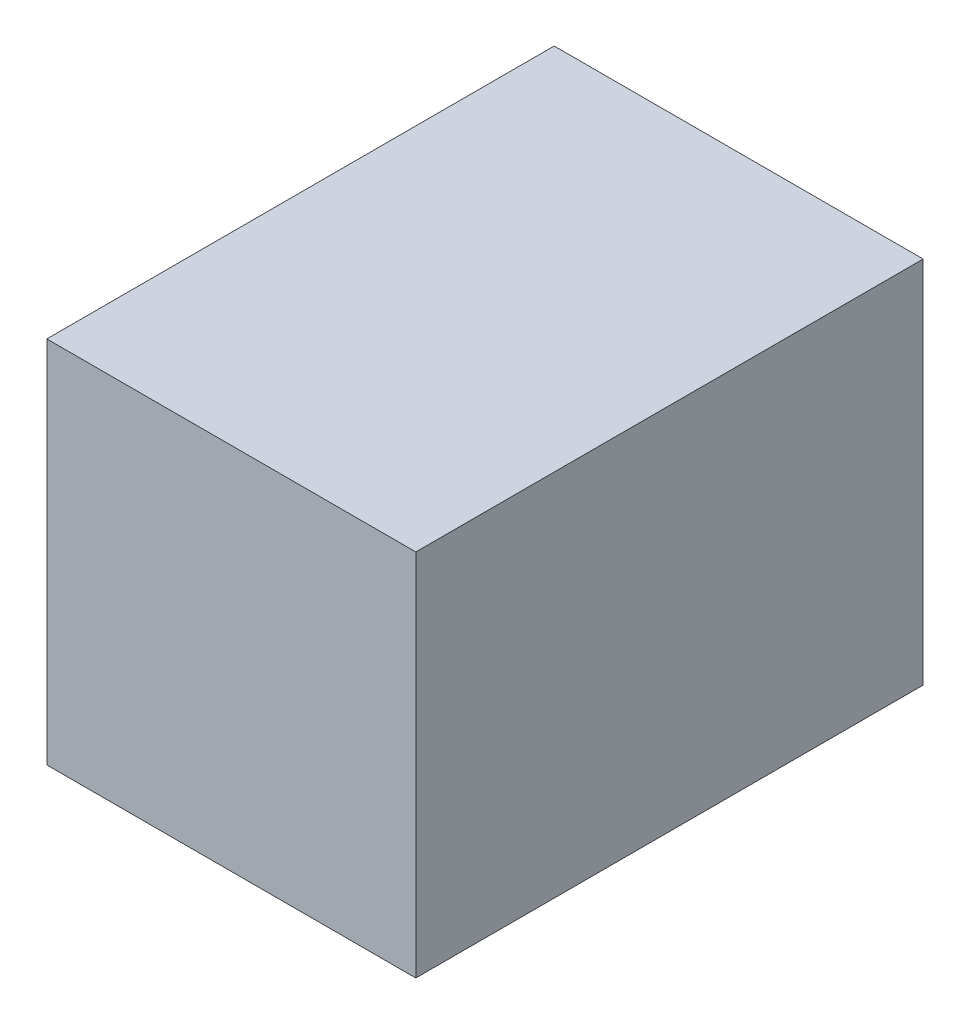
ISO-10303-21;
HEADER;
FILE_DESCRIPTION(('STEP AP214'),'2;1');
FILE_NAME('part.step','',(''),(''),'','','');
FILE_SCHEMA(('AUTOMOTIVE_DESIGN { 1 0 10303 214 1 1 1 1 }'));
ENDSEC;
DATA;
#1=APPLICATION_CONTEXT('core data for automotive mechanical design processes');
#2=APPLICATION_PROTOCOL_DEFINITION('international standard','automotive_design',2000,#1);
#3=PRODUCT_CONTEXT('',#1,'mechanical');
#4=PRODUCT('Part','Part','',(#3));
#5=PRODUCT_RELATED_PRODUCT_CATEGORY('part','',(#4));
#6=PRODUCT_DEFINITION_FORMATION('','',#4);
#7=PRODUCT_DEFINITION_CONTEXT('part definition',#1,'design');
#8=PRODUCT_DEFINITION('design','',#6,#7);
#9=PRODUCT_DEFINITION_SHAPE('','',#8);
#10=(LENGTH_UNIT() NAMED_UNIT(*) SI_UNIT(.MILLI.,.METRE.));
#11=(NAMED_UNIT(*) PLANE_ANGLE_UNIT() SI_UNIT($,.RADIAN.));
#12=(NAMED_UNIT(*) SI_UNIT($,.STERADIAN.) SOLID_ANGLE_UNIT());
#13=UNCERTAINTY_MEASURE_WITH_UNIT(LENGTH_MEASURE(1.E-05),#10,'distance_accuracy_value','');
#14=(GEOMETRIC_REPRESENTATION_CONTEXT(3) GLOBAL_UNCERTAINTY_ASSIGNED_CONTEXT((#13)) GLOBAL_UNIT_ASSIGNED_CONTEXT((#10,
#11,#12)) REPRESENTATION_CONTEXT('',''));
#15=CARTESIAN_POINT('',(0.,0.,0.));
#16=DIRECTION('',(0.,0.,1.));
#17=DIRECTION('',(1.,0.,0.));
#18=AXIS2_PLACEMENT_3D('',#15,#16,#17);
#19=CARTESIAN_POINT('',(0.,0.,34.925));
#20=DIRECTION('',(1.,0.,0.));
#21=DIRECTION('',(0.,0.,-1.));
#22=AXIS2_PLACEMENT_3D('',#19,#20,#21);
#23=PLANE('',#22);
#24=DIRECTION('',(0.,-1.,0.));
#25=VECTOR('',#24,1.);
#26=CARTESIAN_POINT('',(0.,0.,0.));
#27=LINE('',#26,#25);
#28=CARTESIAN_POINT('',(0.,25.4,0.));
#29=VERTEX_POINT('',#28);
#30=CARTESIAN_POINT('',(0.,0.,0.));
#31=VERTEX_POINT('',#30);
#32=EDGE_CURVE('E95',#29,#31,#27,.T.);
#33=ORIENTED_EDGE('',*,*,#32,.T.);
#34=DIRECTION('',(0.,0.,-1.));
#35=VECTOR('',#34,1.);
#36=CARTESIAN_POINT('',(0.,0.,34.925));
#37=LINE('',#36,#35);
#38=CARTESIAN_POINT('',(0.,0.,34.925));
#39=VERTEX_POINT('',#38);
#40=EDGE_CURVE('E11',#39,#31,#37,.T.);
#41=ORIENTED_EDGE('',*,*,#40,.F.);
#42=DIRECTION('',(0.,-1.,0.));
#43=VECTOR('',#42,1.);
#44=CARTESIAN_POINT('',(0.,0.,34.925));
#45=LINE('',#44,#43);
#46=CARTESIAN_POINT('',(0.,25.4,34.925));
#47=VERTEX_POINT('',#46);
#48=EDGE_CURVE('E83',#47,#39,#45,.T.);
#49=ORIENTED_EDGE('',*,*,#48,.F.);
#50=DIRECTION('',(0.,0.,-1.));
#51=VECTOR('',#50,1.);
#52=CARTESIAN_POINT('',(0.,25.4,34.925));
#53=LINE('',#52,#51);
#54=EDGE_CURVE('E91',#47,#29,#53,.T.);
#55=ORIENTED_EDGE('',*,*,#54,.T.);
#56=EDGE_LOOP('',(#33,#41,#49,#55));
#57=FACE_BOUND('',#56,.T.);
#58=ADVANCED_FACE('F32',(#57),#23,.F.);
#59=CARTESIAN_POINT('',(0.,0.,34.925));
#60=DIRECTION('',(0.,1.,0.));
#61=DIRECTION('',(0.,0.,1.));
#62=AXIS2_PLACEMENT_3D('',#59,#60,#61);
#63=PLANE('',#62);
#64=DIRECTION('',(1.,0.,0.));
#65=VECTOR('',#64,1.);
#66=CARTESIAN_POINT('',(0.,0.,0.));
#67=LINE('',#66,#65);
#68=CARTESIAN_POINT('',(25.4,0.,0.));
#69=VERTEX_POINT('',#68);
#70=EDGE_CURVE('E87',#31,#69,#67,.T.);
#71=ORIENTED_EDGE('',*,*,#70,.T.);
#72=DIRECTION('',(0.,0.,-1.));
#73=VECTOR('',#72,1.);
#74=CARTESIAN_POINT('',(25.4,0.,34.925));
#75=LINE('',#74,#73);
#76=CARTESIAN_POINT('',(25.4,0.,34.925));
#77=VERTEX_POINT('',#76);
#78=EDGE_CURVE('E40',#77,#69,#75,.T.);
#79=ORIENTED_EDGE('',*,*,#78,.F.);
#80=DIRECTION('',(1.,0.,0.));
#81=VECTOR('',#80,1.);
#82=CARTESIAN_POINT('',(0.,0.,34.925));
#83=LINE('',#82,#81);
#84=EDGE_CURVE('E78',#39,#77,#83,.T.);
#85=ORIENTED_EDGE('',*,*,#84,.F.);
#86=ORIENTED_EDGE('',*,*,#40,.T.);
#87=EDGE_LOOP('',(#71,#79,#85,#86));
#88=FACE_BOUND('',#87,.T.);
#89=ADVANCED_FACE('F86',(#88),#63,.F.);
#90=CARTESIAN_POINT('',(25.4,0.,34.925));
#91=DIRECTION('',(-1.,0.,0.));
#92=DIRECTION('',(0.,-1.,0.));
#93=AXIS2_PLACEMENT_3D('',#90,#91,#92);
#94=PLANE('',#93);
#95=DIRECTION('',(0.,1.,0.));
#96=VECTOR('',#95,1.);
#97=CARTESIAN_POINT('',(25.4,0.,0.));
#98=LINE('',#97,#96);
#99=CARTESIAN_POINT('',(25.4,25.4,0.));
#100=VERTEX_POINT('',#99);
#101=EDGE_CURVE('E65',#69,#100,#98,.T.);
#102=ORIENTED_EDGE('',*,*,#101,.T.);
#103=DIRECTION('',(0.,0.,-1.));
#104=VECTOR('',#103,1.);
#105=CARTESIAN_POINT('',(25.4,25.4,34.925));
#106=LINE('',#105,#104);
#107=CARTESIAN_POINT('',(25.4,25.4,34.925));
#108=VERTEX_POINT('',#107);
#109=EDGE_CURVE('E88',#108,#100,#106,.T.);
#110=ORIENTED_EDGE('',*,*,#109,.F.);
#111=DIRECTION('',(0.,1.,0.));
#112=VECTOR('',#111,1.);
#113=CARTESIAN_POINT('',(25.4,0.,34.925));
#114=LINE('',#113,#112);
#115=EDGE_CURVE('E81',#77,#108,#114,.T.);
#116=ORIENTED_EDGE('',*,*,#115,.F.);
#117=ORIENTED_EDGE('',*,*,#78,.T.);
#118=EDGE_LOOP('',(#102,#110,#116,#117));
#119=FACE_BOUND('',#118,.T.);
#120=ADVANCED_FACE('F89',(#119),#94,.F.);
#121=CARTESIAN_POINT('',(0.,25.4,34.925));
#122=DIRECTION('',(0.,-1.,0.));
#123=DIRECTION('',(0.,0.,-1.));
#124=AXIS2_PLACEMENT_3D('',#121,#122,#123);
#125=PLANE('',#124);
#126=DIRECTION('',(-1.,0.,0.));
#127=VECTOR('',#126,1.);
#128=CARTESIAN_POINT('',(0.,25.4,0.));
#129=LINE('',#128,#127);
#130=EDGE_CURVE('E71',#100,#29,#129,.T.);
#131=ORIENTED_EDGE('',*,*,#130,.T.);
#132=ORIENTED_EDGE('',*,*,#54,.F.);
#133=DIRECTION('',(-1.,0.,0.));
#134=VECTOR('',#133,1.);
#135=CARTESIAN_POINT('',(0.,25.4,34.925));
#136=LINE('',#135,#134);
#137=EDGE_CURVE('E48',#108,#47,#136,.T.);
#138=ORIENTED_EDGE('',*,*,#137,.F.);
#139=ORIENTED_EDGE('',*,*,#109,.T.);
#140=EDGE_LOOP('',(#131,#132,#138,#139));
#141=FACE_BOUND('',#140,.T.);
#142=ADVANCED_FACE('F102',(#141),#125,.F.);
#143=CARTESIAN_POINT('',(0.,0.,34.925));
#144=DIRECTION('',(0.,0.,-1.));
#145=DIRECTION('',(-1.,0.,0.));
#146=AXIS2_PLACEMENT_3D('',#143,#144,#145);
#147=PLANE('',#146);
#148=ORIENTED_EDGE('',*,*,#48,.T.);
#149=ORIENTED_EDGE('',*,*,#84,.T.);
#150=ORIENTED_EDGE('',*,*,#115,.T.);
#151=ORIENTED_EDGE('',*,*,#137,.T.);
#152=EDGE_LOOP('',(#148,#149,#150,#151));
#153=FACE_BOUND('',#152,.T.);
#154=ADVANCED_FACE('F79',(#153),#147,.F.);
#155=CARTESIAN_POINT('',(0.,0.,0.));
#156=DIRECTION('',(0.,0.,-1.));
#157=DIRECTION('',(-1.,0.,0.));
#158=AXIS2_PLACEMENT_3D('',#155,#156,#157);
#159=PLANE('',#158);
#160=ORIENTED_EDGE('',*,*,#32,.F.);
#161=ORIENTED_EDGE('',*,*,#130,.F.);
#162=ORIENTED_EDGE('',*,*,#101,.F.);
#163=ORIENTED_EDGE('',*,*,#70,.F.);
#164=EDGE_LOOP('',(#160,#161,#162,#163));
#165=FACE_BOUND('',#164,.T.);
#166=ADVANCED_FACE('F105',(#165),#159,.T.);
#167=CLOSED_SHELL('',(#58,#89,#120,#142,#154,#166));
#168=MANIFOLD_SOLID_BREP('B2',#167);
#169=ADVANCED_BREP_SHAPE_REPRESENTATION('',(#18,#168),#14);
#170=SHAPE_DEFINITION_REPRESENTATION(#9,#169);
ENDSEC;
END-ISO-10303-21;
